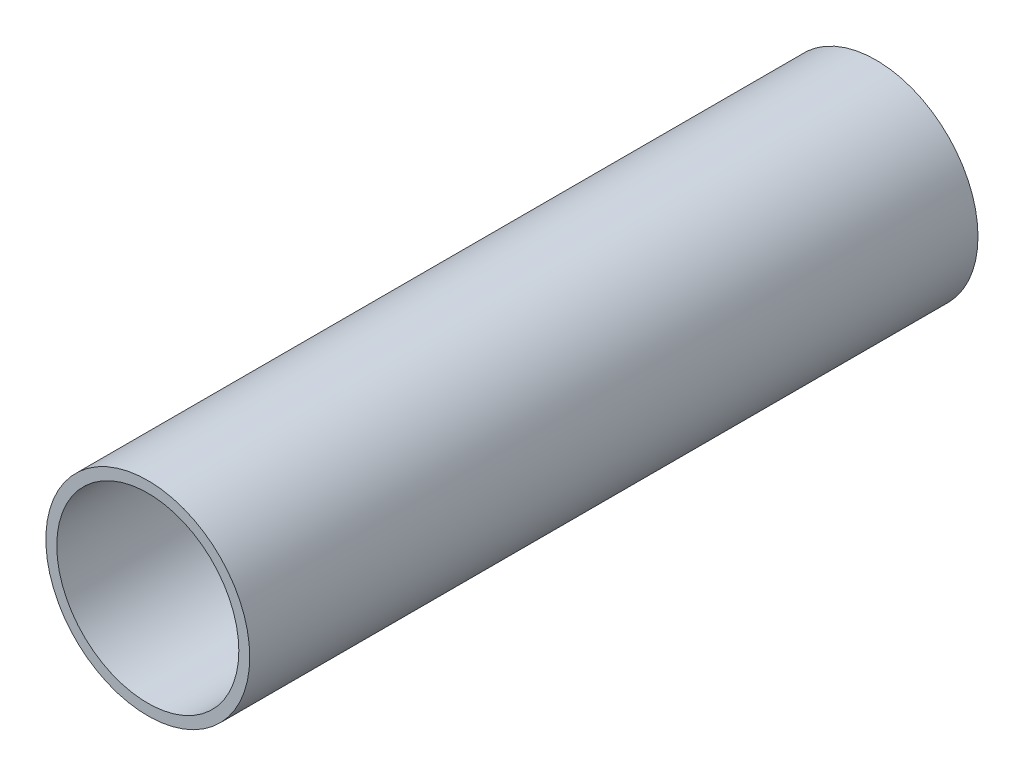
ISO-10303-21;
HEADER;
FILE_DESCRIPTION(('STEP AP214'),'2;1');
FILE_NAME('part.step','',(''),(''),'','','');
FILE_SCHEMA(('AUTOMOTIVE_DESIGN { 1 0 10303 214 1 1 1 1 }'));
ENDSEC;
DATA;
#1=APPLICATION_CONTEXT('core data for automotive mechanical design processes');
#2=APPLICATION_PROTOCOL_DEFINITION('international standard','automotive_design',2000,#1);
#3=PRODUCT_CONTEXT('',#1,'mechanical');
#4=PRODUCT('Part','Part','',(#3));
#5=PRODUCT_RELATED_PRODUCT_CATEGORY('part','',(#4));
#6=PRODUCT_DEFINITION_FORMATION('','',#4);
#7=PRODUCT_DEFINITION_CONTEXT('part definition',#1,'design');
#8=PRODUCT_DEFINITION('design','',#6,#7);
#9=PRODUCT_DEFINITION_SHAPE('','',#8);
#10=(LENGTH_UNIT() NAMED_UNIT(*) SI_UNIT(.MILLI.,.METRE.));
#11=(NAMED_UNIT(*) PLANE_ANGLE_UNIT() SI_UNIT($,.RADIAN.));
#12=(NAMED_UNIT(*) SI_UNIT($,.STERADIAN.) SOLID_ANGLE_UNIT());
#13=UNCERTAINTY_MEASURE_WITH_UNIT(LENGTH_MEASURE(1.E-05),#10,'distance_accuracy_value','');
#14=(GEOMETRIC_REPRESENTATION_CONTEXT(3) GLOBAL_UNCERTAINTY_ASSIGNED_CONTEXT((#13)) GLOBAL_UNIT_ASSIGNED_CONTEXT((#10,
#11,#12)) REPRESENTATION_CONTEXT('',''));
#15=CARTESIAN_POINT('',(0.,0.,0.));
#16=DIRECTION('',(0.,0.,1.));
#17=DIRECTION('',(1.,0.,0.));
#18=AXIS2_PLACEMENT_3D('',#15,#16,#17);
#19=CARTESIAN_POINT('',(0.,0.,254.));
#20=DIRECTION('',(0.,0.,1.));
#21=DIRECTION('',(1.,0.,0.));
#22=AXIS2_PLACEMENT_3D('',#19,#20,#21);
#23=PLANE('',#22);
#24=CARTESIAN_POINT('',(0.,0.,254.));
#25=DIRECTION('',(0.,0.,1.));
#26=DIRECTION('',(1.,0.,0.));
#27=AXIS2_PLACEMENT_3D('',#24,#25,#26);
#28=CIRCLE('',#27,35.56);
#29=CARTESIAN_POINT('',(35.56,0.,254.));
#30=VERTEX_POINT('',#29);
#31=EDGE_CURVE('E10',#30,#30,#28,.T.);
#32=ORIENTED_EDGE('',*,*,#31,.T.);
#33=EDGE_LOOP('',(#32));
#34=FACE_BOUND('',#33,.T.);
#35=CARTESIAN_POINT('',(0.,0.,254.));
#36=DIRECTION('',(0.,0.,1.));
#37=DIRECTION('',(1.,0.,0.));
#38=AXIS2_PLACEMENT_3D('',#35,#36,#37);
#39=CIRCLE('',#38,31.75);
#40=CARTESIAN_POINT('',(31.75,0.,254.));
#41=VERTEX_POINT('',#40);
#42=EDGE_CURVE('E55',#41,#41,#39,.T.);
#43=ORIENTED_EDGE('',*,*,#42,.F.);
#44=EDGE_LOOP('',(#43));
#45=FACE_BOUND('',#44,.T.);
#46=ADVANCED_FACE('F42',(#34,#45),#23,.T.);
#47=CARTESIAN_POINT('',(0.,0.,0.));
#48=DIRECTION('',(0.,0.,1.));
#49=DIRECTION('',(1.,0.,0.));
#50=AXIS2_PLACEMENT_3D('',#47,#48,#49);
#51=PLANE('',#50);
#52=CARTESIAN_POINT('',(0.,0.,0.));
#53=DIRECTION('',(0.,0.,1.));
#54=DIRECTION('',(1.,0.,0.));
#55=AXIS2_PLACEMENT_3D('',#52,#53,#54);
#56=CIRCLE('',#55,35.56);
#57=CARTESIAN_POINT('',(35.56,0.,0.));
#58=VERTEX_POINT('',#57);
#59=EDGE_CURVE('E46',#58,#58,#56,.T.);
#60=ORIENTED_EDGE('',*,*,#59,.F.);
#61=EDGE_LOOP('',(#60));
#62=FACE_BOUND('',#61,.T.);
#63=CARTESIAN_POINT('',(0.,0.,0.));
#64=DIRECTION('',(0.,0.,1.));
#65=DIRECTION('',(1.,0.,0.));
#66=AXIS2_PLACEMENT_3D('',#63,#64,#65);
#67=CIRCLE('',#66,31.75);
#68=CARTESIAN_POINT('',(31.75,0.,0.));
#69=VERTEX_POINT('',#68);
#70=EDGE_CURVE('E57',#69,#69,#67,.T.);
#71=ORIENTED_EDGE('',*,*,#70,.T.);
#72=EDGE_LOOP('',(#71));
#73=FACE_BOUND('',#72,.T.);
#74=ADVANCED_FACE('F69',(#62,#73),#51,.F.);
#75=CARTESIAN_POINT('',(0.,0.,254.));
#76=DIRECTION('',(0.,0.,-1.));
#77=DIRECTION('',(-1.,0.,0.));
#78=AXIS2_PLACEMENT_3D('',#75,#76,#77);
#79=CYLINDRICAL_SURFACE('',#78,35.56);
#80=ORIENTED_EDGE('',*,*,#31,.F.);
#81=EDGE_LOOP('',(#80));
#82=FACE_BOUND('',#81,.T.);
#83=ORIENTED_EDGE('',*,*,#59,.T.);
#84=EDGE_LOOP('',(#83));
#85=FACE_BOUND('',#84,.T.);
#86=ADVANCED_FACE('F44',(#82,#85),#79,.T.);
#87=CARTESIAN_POINT('',(0.,0.,254.));
#88=DIRECTION('',(0.,0.,-1.));
#89=DIRECTION('',(-1.,0.,0.));
#90=AXIS2_PLACEMENT_3D('',#87,#88,#89);
#91=CYLINDRICAL_SURFACE('',#90,31.75);
#92=ORIENTED_EDGE('',*,*,#42,.T.);
#93=EDGE_LOOP('',(#92));
#94=FACE_BOUND('',#93,.T.);
#95=ORIENTED_EDGE('',*,*,#70,.F.);
#96=EDGE_LOOP('',(#95));
#97=FACE_BOUND('',#96,.T.);
#98=ADVANCED_FACE('F65',(#94,#97),#91,.F.);
#99=CLOSED_SHELL('',(#46,#74,#86,#98));
#100=MANIFOLD_SOLID_BREP('B2',#99);
#101=ADVANCED_BREP_SHAPE_REPRESENTATION('',(#18,#100),#14);
#102=SHAPE_DEFINITION_REPRESENTATION(#9,#101);
ENDSEC;
END-ISO-10303-21;
